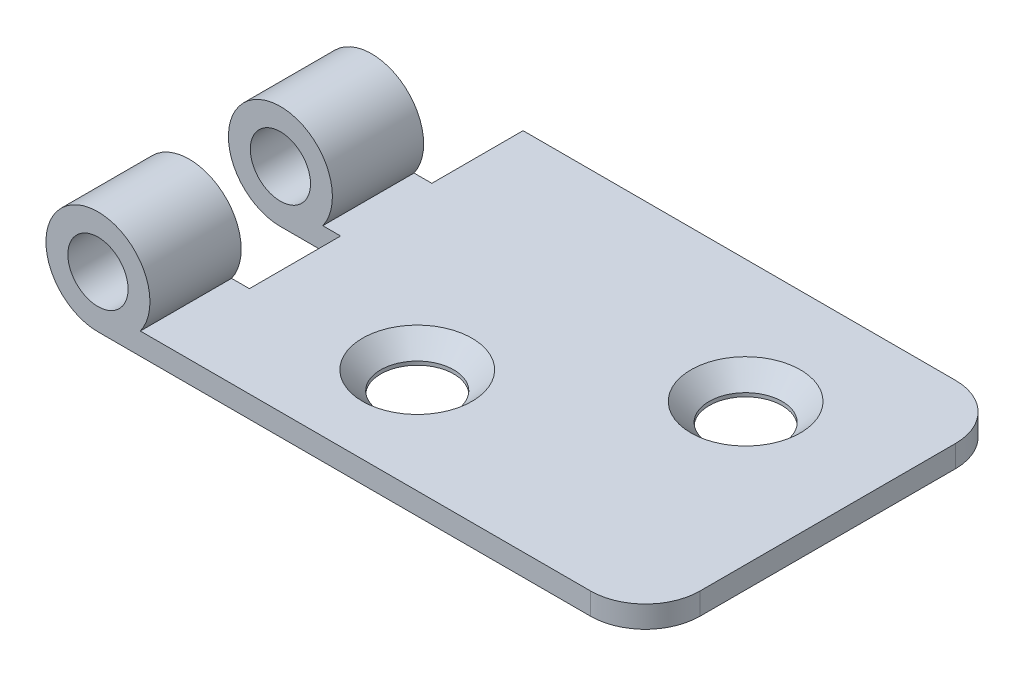
ISO-10303-21;
HEADER;
FILE_DESCRIPTION(('STEP AP214'),'2;1');
FILE_NAME('part.step','',(''),(''),'','','');
FILE_SCHEMA(('AUTOMOTIVE_DESIGN { 1 0 10303 214 1 1 1 1 }'));
ENDSEC;
DATA;
#1=APPLICATION_CONTEXT('core data for automotive mechanical design processes');
#2=APPLICATION_PROTOCOL_DEFINITION('international standard','automotive_design',2000,#1);
#3=PRODUCT_CONTEXT('',#1,'mechanical');
#4=PRODUCT('Part','Part','',(#3));
#5=PRODUCT_RELATED_PRODUCT_CATEGORY('part','',(#4));
#6=PRODUCT_DEFINITION_FORMATION('','',#4);
#7=PRODUCT_DEFINITION_CONTEXT('part definition',#1,'design');
#8=PRODUCT_DEFINITION('design','',#6,#7);
#9=PRODUCT_DEFINITION_SHAPE('','',#8);
#10=(LENGTH_UNIT() NAMED_UNIT(*) SI_UNIT(.MILLI.,.METRE.));
#11=(NAMED_UNIT(*) PLANE_ANGLE_UNIT() SI_UNIT($,.RADIAN.));
#12=(NAMED_UNIT(*) SI_UNIT($,.STERADIAN.) SOLID_ANGLE_UNIT());
#13=UNCERTAINTY_MEASURE_WITH_UNIT(LENGTH_MEASURE(1.E-05),#10,'distance_accuracy_value','');
#14=(GEOMETRIC_REPRESENTATION_CONTEXT(3) GLOBAL_UNCERTAINTY_ASSIGNED_CONTEXT((#13)) GLOBAL_UNIT_ASSIGNED_CONTEXT((#10,
#11,#12)) REPRESENTATION_CONTEXT('',''));
#15=CARTESIAN_POINT('',(0.,0.,0.));
#16=DIRECTION('',(0.,0.,1.));
#17=DIRECTION('',(1.,0.,0.));
#18=AXIS2_PLACEMENT_3D('',#15,#16,#17);
#19=CARTESIAN_POINT('',(30.,-1.65,20.));
#20=DIRECTION('',(0.,-1.,0.));
#21=DIRECTION('',(1.,0.,0.));
#22=AXIS2_PLACEMENT_3D('',#19,#20,#21);
#23=PLANE('',#22);
#24=CARTESIAN_POINT('',(11.75,-1.65,14.25));
#25=DIRECTION('',(0.,1.,0.));
#26=DIRECTION('',(0.,0.,1.));
#27=AXIS2_PLACEMENT_3D('',#24,#25,#26);
#28=CIRCLE('',#27,3.);
#29=CARTESIAN_POINT('',(11.75,-1.65,17.25));
#30=VERTEX_POINT('',#29);
#31=EDGE_CURVE('E394',#30,#30,#28,.T.);
#32=ORIENTED_EDGE('',*,*,#31,.F.);
#33=EDGE_LOOP('',(#32));
#34=FACE_BOUND('',#33,.T.);
#35=CARTESIAN_POINT('',(22.25,-1.65,6.75));
#36=DIRECTION('',(0.,1.,0.));
#37=DIRECTION('',(0.,0.,1.));
#38=AXIS2_PLACEMENT_3D('',#35,#36,#37);
#39=CIRCLE('',#38,3.);
#40=CARTESIAN_POINT('',(22.25,-1.65,9.75));
#41=VERTEX_POINT('',#40);
#42=EDGE_CURVE('E229',#41,#41,#39,.T.);
#43=ORIENTED_EDGE('',*,*,#42,.F.);
#44=EDGE_LOOP('',(#43));
#45=FACE_BOUND('',#44,.T.);
#46=DIRECTION('',(0.,0.,-1.));
#47=VECTOR('',#46,1.);
#48=CARTESIAN_POINT('',(30.,-1.65,20.));
#49=LINE('',#48,#47);
#50=CARTESIAN_POINT('',(30.,-1.65,17.));
#51=VERTEX_POINT('',#50);
#52=CARTESIAN_POINT('',(30.,-1.65,3.));
#53=VERTEX_POINT('',#52);
#54=EDGE_CURVE('E198',#51,#53,#49,.T.);
#55=ORIENTED_EDGE('',*,*,#54,.T.);
#56=CARTESIAN_POINT('',(27.,-1.65,3.));
#57=DIRECTION('',(0.,-1.,0.));
#58=DIRECTION('',(1.,0.,0.));
#59=AXIS2_PLACEMENT_3D('',#56,#57,#58);
#60=CIRCLE('',#59,3.);
#61=CARTESIAN_POINT('',(27.,-1.65,0.));
#62=VERTEX_POINT('',#61);
#63=EDGE_CURVE('E220',#53,#62,#60,.F.);
#64=ORIENTED_EDGE('',*,*,#63,.T.);
#65=DIRECTION('',(-1.,0.,0.));
#66=VECTOR('',#65,1.);
#67=CARTESIAN_POINT('',(30.,-1.65,0.));
#68=LINE('',#67,#66);
#69=CARTESIAN_POINT('',(3.3,-1.65,0.));
#70=VERTEX_POINT('',#69);
#71=EDGE_CURVE('E178',#62,#70,#68,.T.);
#72=ORIENTED_EDGE('',*,*,#71,.T.);
#73=DIRECTION('',(0.,0.,-1.));
#74=VECTOR('',#73,1.);
#75=CARTESIAN_POINT('',(3.3,-1.65,20.));
#76=LINE('',#75,#74);
#77=CARTESIAN_POINT('',(3.3,-1.65,5.));
#78=VERTEX_POINT('',#77);
#79=EDGE_CURVE('E172',#78,#70,#76,.T.);
#80=ORIENTED_EDGE('',*,*,#79,.F.);
#81=DIRECTION('',(1.,0.,0.));
#82=VECTOR('',#81,1.);
#83=CARTESIAN_POINT('',(30.,-1.65,5.));
#84=LINE('',#83,#82);
#85=CARTESIAN_POINT('',(2.32379000772445,-1.65,5.));
#86=VERTEX_POINT('',#85);
#87=EDGE_CURVE('E170',#86,#78,#84,.T.);
#88=ORIENTED_EDGE('',*,*,#87,.F.);
#89=DIRECTION('',(0.,0.,-1.));
#90=VECTOR('',#89,1.);
#91=CARTESIAN_POINT('',(2.32379000772445,-1.65,20.));
#92=LINE('',#91,#90);
#93=CARTESIAN_POINT('',(2.32379000772445,-1.65,10.));
#94=VERTEX_POINT('',#93);
#95=EDGE_CURVE('E195',#94,#86,#92,.T.);
#96=ORIENTED_EDGE('',*,*,#95,.F.);
#97=DIRECTION('',(-1.,0.,0.));
#98=VECTOR('',#97,1.);
#99=CARTESIAN_POINT('',(30.,-1.65,10.));
#100=LINE('',#99,#98);
#101=CARTESIAN_POINT('',(3.3,-1.65,10.));
#102=VERTEX_POINT('',#101);
#103=EDGE_CURVE('E153',#102,#94,#100,.T.);
#104=ORIENTED_EDGE('',*,*,#103,.F.);
#105=DIRECTION('',(0.,0.,-1.));
#106=VECTOR('',#105,1.);
#107=CARTESIAN_POINT('',(3.3,-1.65,20.));
#108=LINE('',#107,#106);
#109=CARTESIAN_POINT('',(3.3,-1.65,15.));
#110=VERTEX_POINT('',#109);
#111=EDGE_CURVE('E142',#110,#102,#108,.T.);
#112=ORIENTED_EDGE('',*,*,#111,.F.);
#113=DIRECTION('',(1.,0.,0.));
#114=VECTOR('',#113,1.);
#115=CARTESIAN_POINT('',(30.,-1.65,15.));
#116=LINE('',#115,#114);
#117=CARTESIAN_POINT('',(2.32379000772445,-1.65,15.));
#118=VERTEX_POINT('',#117);
#119=EDGE_CURVE('E126',#118,#110,#116,.T.);
#120=ORIENTED_EDGE('',*,*,#119,.F.);
#121=CARTESIAN_POINT('',(2.32379000772445,-1.65,20.));
#122=VERTEX_POINT('',#121);
#123=EDGE_CURVE('E196',#122,#118,#92,.T.);
#124=ORIENTED_EDGE('',*,*,#123,.F.);
#125=DIRECTION('',(-1.,0.,0.));
#126=VECTOR('',#125,1.);
#127=CARTESIAN_POINT('',(30.,-1.65,20.));
#128=LINE('',#127,#126);
#129=CARTESIAN_POINT('',(27.,-1.65,20.));
#130=VERTEX_POINT('',#129);
#131=EDGE_CURVE('E179',#130,#122,#128,.T.);
#132=ORIENTED_EDGE('',*,*,#131,.F.);
#133=CARTESIAN_POINT('',(27.,-1.65,17.));
#134=DIRECTION('',(0.,-1.,0.));
#135=DIRECTION('',(1.,0.,0.));
#136=AXIS2_PLACEMENT_3D('',#133,#134,#135);
#137=CIRCLE('',#136,3.);
#138=EDGE_CURVE('E218',#130,#51,#137,.F.);
#139=ORIENTED_EDGE('',*,*,#138,.T.);
#140=EDGE_LOOP('',(#55,#64,#72,#80,#88,#96,#104,#112,#120,#124,#132,#139));
#141=FACE_BOUND('',#140,.T.);
#142=ADVANCED_FACE('F32',(#34,#45,#141),#23,.F.);
#143=CARTESIAN_POINT('',(0.,0.,20.));
#144=DIRECTION('',(0.,0.,-1.));
#145=DIRECTION('',(-1.,0.,0.));
#146=AXIS2_PLACEMENT_3D('',#143,#144,#145);
#147=CYLINDRICAL_SURFACE('',#146,2.85);
#148=CARTESIAN_POINT('',(0.,0.,10.));
#149=DIRECTION('',(0.,0.,1.));
#150=DIRECTION('',(1.,0.,0.));
#151=AXIS2_PLACEMENT_3D('',#148,#149,#150);
#152=CIRCLE('',#151,2.85);
#153=CARTESIAN_POINT('',(0.,-2.85,10.));
#154=VERTEX_POINT('',#153);
#155=EDGE_CURVE('E158',#94,#154,#152,.T.);
#156=ORIENTED_EDGE('',*,*,#155,.F.);
#157=ORIENTED_EDGE('',*,*,#95,.T.);
#158=CARTESIAN_POINT('',(0.,0.,5.));
#159=DIRECTION('',(0.,0.,-1.));
#160=DIRECTION('',(-1.,0.,0.));
#161=AXIS2_PLACEMENT_3D('',#158,#159,#160);
#162=CIRCLE('',#161,2.85);
#163=CARTESIAN_POINT('',(0.,-2.85,5.));
#164=VERTEX_POINT('',#163);
#165=EDGE_CURVE('E167',#164,#86,#162,.T.);
#166=ORIENTED_EDGE('',*,*,#165,.F.);
#167=DIRECTION('',(0.,0.,-1.));
#168=VECTOR('',#167,1.);
#169=CARTESIAN_POINT('',(0.,-2.85,20.));
#170=LINE('',#169,#168);
#171=EDGE_CURVE('E191',#154,#164,#170,.T.);
#172=ORIENTED_EDGE('',*,*,#171,.F.);
#173=EDGE_LOOP('',(#156,#157,#166,#172));
#174=FACE_BOUND('',#173,.T.);
#175=ADVANCED_FACE('F249',(#174),#147,.T.);
#176=CARTESIAN_POINT('',(0.,0.,15.));
#177=DIRECTION('',(0.,0.,-1.));
#178=DIRECTION('',(-1.,0.,0.));
#179=AXIS2_PLACEMENT_3D('',#176,#177,#178);
#180=CIRCLE('',#179,2.85);
#181=CARTESIAN_POINT('',(0.,-2.85,15.));
#182=VERTEX_POINT('',#181);
#183=EDGE_CURVE('E132',#182,#118,#180,.T.);
#184=ORIENTED_EDGE('',*,*,#183,.F.);
#185=CARTESIAN_POINT('',(0.,-2.85,20.));
#186=VERTEX_POINT('',#185);
#187=EDGE_CURVE('E192',#186,#182,#170,.T.);
#188=ORIENTED_EDGE('',*,*,#187,.F.);
#189=CARTESIAN_POINT('',(0.,0.,20.));
#190=DIRECTION('',(0.,0.,1.));
#191=DIRECTION('',(1.,0.,0.));
#192=AXIS2_PLACEMENT_3D('',#189,#190,#191);
#193=CIRCLE('',#192,2.85);
#194=EDGE_CURVE('E181',#122,#186,#193,.T.);
#195=ORIENTED_EDGE('',*,*,#194,.F.);
#196=ORIENTED_EDGE('',*,*,#123,.T.);
#197=EDGE_LOOP('',(#184,#188,#195,#196));
#198=FACE_BOUND('',#197,.T.);
#199=ADVANCED_FACE('F277',(#198),#147,.T.);
#200=CARTESIAN_POINT('',(30.,-2.85,20.));
#201=DIRECTION('',(0.,1.,0.));
#202=DIRECTION('',(-1.,0.,0.));
#203=AXIS2_PLACEMENT_3D('',#200,#201,#202);
#204=PLANE('',#203);
#205=CARTESIAN_POINT('',(11.75,-2.85,14.25));
#206=DIRECTION('',(0.,1.,0.));
#207=DIRECTION('',(-1.,0.,0.));
#208=AXIS2_PLACEMENT_3D('',#205,#206,#207);
#209=CIRCLE('',#208,2.);
#210=CARTESIAN_POINT('',(9.75,-2.85,14.25));
#211=VERTEX_POINT('',#210);
#212=EDGE_CURVE('E36',#211,#211,#209,.T.);
#213=ORIENTED_EDGE('',*,*,#212,.T.);
#214=EDGE_LOOP('',(#213));
#215=FACE_BOUND('',#214,.T.);
#216=CARTESIAN_POINT('',(22.25,-2.85,6.75));
#217=DIRECTION('',(0.,1.,0.));
#218=DIRECTION('',(-1.,0.,0.));
#219=AXIS2_PLACEMENT_3D('',#216,#217,#218);
#220=CIRCLE('',#219,2.);
#221=CARTESIAN_POINT('',(20.25,-2.85,6.75));
#222=VERTEX_POINT('',#221);
#223=EDGE_CURVE('E148',#222,#222,#220,.T.);
#224=ORIENTED_EDGE('',*,*,#223,.T.);
#225=EDGE_LOOP('',(#224));
#226=FACE_BOUND('',#225,.T.);
#227=DIRECTION('',(1.,0.,0.));
#228=VECTOR('',#227,1.);
#229=CARTESIAN_POINT('',(30.,-2.85,0.));
#230=LINE('',#229,#228);
#231=CARTESIAN_POINT('',(3.3,-2.85,0.));
#232=VERTEX_POINT('',#231);
#233=CARTESIAN_POINT('',(27.,-2.85,0.));
#234=VERTEX_POINT('',#233);
#235=EDGE_CURVE('E182',#232,#234,#230,.T.);
#236=ORIENTED_EDGE('',*,*,#235,.T.);
#237=CARTESIAN_POINT('',(27.,-2.85,3.));
#238=DIRECTION('',(0.,1.,0.));
#239=DIRECTION('',(-1.,0.,0.));
#240=AXIS2_PLACEMENT_3D('',#237,#238,#239);
#241=CIRCLE('',#240,3.);
#242=CARTESIAN_POINT('',(30.,-2.85,3.));
#243=VERTEX_POINT('',#242);
#244=EDGE_CURVE('E41',#234,#243,#241,.F.);
#245=ORIENTED_EDGE('',*,*,#244,.T.);
#246=DIRECTION('',(0.,0.,-1.));
#247=VECTOR('',#246,1.);
#248=CARTESIAN_POINT('',(30.,-2.85,20.));
#249=LINE('',#248,#247);
#250=CARTESIAN_POINT('',(30.,-2.85,17.));
#251=VERTEX_POINT('',#250);
#252=EDGE_CURVE('E186',#251,#243,#249,.T.);
#253=ORIENTED_EDGE('',*,*,#252,.F.);
#254=CARTESIAN_POINT('',(27.,-2.85,17.));
#255=DIRECTION('',(0.,1.,0.));
#256=DIRECTION('',(-1.,0.,0.));
#257=AXIS2_PLACEMENT_3D('',#254,#255,#256);
#258=CIRCLE('',#257,3.);
#259=CARTESIAN_POINT('',(27.,-2.85,20.));
#260=VERTEX_POINT('',#259);
#261=EDGE_CURVE('E49',#251,#260,#258,.F.);
#262=ORIENTED_EDGE('',*,*,#261,.T.);
#263=DIRECTION('',(1.,0.,0.));
#264=VECTOR('',#263,1.);
#265=CARTESIAN_POINT('',(30.,-2.85,20.));
#266=LINE('',#265,#264);
#267=EDGE_CURVE('E184',#186,#260,#266,.T.);
#268=ORIENTED_EDGE('',*,*,#267,.F.);
#269=ORIENTED_EDGE('',*,*,#187,.T.);
#270=DIRECTION('',(-1.,0.,0.));
#271=VECTOR('',#270,1.);
#272=CARTESIAN_POINT('',(30.,-2.85,15.));
#273=LINE('',#272,#271);
#274=CARTESIAN_POINT('',(3.3,-2.85,15.));
#275=VERTEX_POINT('',#274);
#276=EDGE_CURVE('E208',#275,#182,#273,.T.);
#277=ORIENTED_EDGE('',*,*,#276,.F.);
#278=DIRECTION('',(0.,0.,1.));
#279=VECTOR('',#278,1.);
#280=CARTESIAN_POINT('',(3.3,-2.85,20.));
#281=LINE('',#280,#279);
#282=CARTESIAN_POINT('',(3.3,-2.85,10.));
#283=VERTEX_POINT('',#282);
#284=EDGE_CURVE('E145',#283,#275,#281,.T.);
#285=ORIENTED_EDGE('',*,*,#284,.F.);
#286=DIRECTION('',(1.,0.,0.));
#287=VECTOR('',#286,1.);
#288=CARTESIAN_POINT('',(30.,-2.85,10.));
#289=LINE('',#288,#287);
#290=EDGE_CURVE('E211',#154,#283,#289,.T.);
#291=ORIENTED_EDGE('',*,*,#290,.F.);
#292=ORIENTED_EDGE('',*,*,#171,.T.);
#293=DIRECTION('',(-1.,0.,0.));
#294=VECTOR('',#293,1.);
#295=CARTESIAN_POINT('',(30.,-2.85,5.));
#296=LINE('',#295,#294);
#297=CARTESIAN_POINT('',(3.3,-2.85,5.));
#298=VERTEX_POINT('',#297);
#299=EDGE_CURVE('E164',#298,#164,#296,.T.);
#300=ORIENTED_EDGE('',*,*,#299,.F.);
#301=DIRECTION('',(0.,0.,1.));
#302=VECTOR('',#301,1.);
#303=CARTESIAN_POINT('',(3.3,-2.85,20.));
#304=LINE('',#303,#302);
#305=EDGE_CURVE('E200',#232,#298,#304,.T.);
#306=ORIENTED_EDGE('',*,*,#305,.F.);
#307=EDGE_LOOP('',(#236,#245,#253,#262,#268,#269,#277,#285,#291,#292,#300,#306));
#308=FACE_BOUND('',#307,.T.);
#309=ADVANCED_FACE('F246',(#215,#226,#308),#204,.F.);
#310=CARTESIAN_POINT('',(0.,0.,20.));
#311=DIRECTION('',(0.,0.,-1.));
#312=DIRECTION('',(-1.,0.,0.));
#313=AXIS2_PLACEMENT_3D('',#310,#311,#312);
#314=CYLINDRICAL_SURFACE('',#313,1.65);
#315=CARTESIAN_POINT('',(0.,0.,5.));
#316=DIRECTION('',(0.,0.,-1.));
#317=DIRECTION('',(-1.,0.,0.));
#318=AXIS2_PLACEMENT_3D('',#315,#316,#317);
#319=CIRCLE('',#318,1.65);
#320=CARTESIAN_POINT('',(-1.65,0.,5.));
#321=VERTEX_POINT('',#320);
#322=EDGE_CURVE('E163',#321,#321,#319,.T.);
#323=ORIENTED_EDGE('',*,*,#322,.T.);
#324=EDGE_LOOP('',(#323));
#325=FACE_BOUND('',#324,.T.);
#326=CARTESIAN_POINT('',(0.,0.,10.));
#327=DIRECTION('',(0.,0.,1.));
#328=DIRECTION('',(1.,0.,0.));
#329=AXIS2_PLACEMENT_3D('',#326,#327,#328);
#330=CIRCLE('',#329,1.65);
#331=CARTESIAN_POINT('',(1.65,0.,10.));
#332=VERTEX_POINT('',#331);
#333=EDGE_CURVE('E137',#332,#332,#330,.T.);
#334=ORIENTED_EDGE('',*,*,#333,.T.);
#335=EDGE_LOOP('',(#334));
#336=FACE_BOUND('',#335,.T.);
#337=ADVANCED_FACE('F284',(#325,#336),#314,.F.);
#338=CARTESIAN_POINT('',(0.,0.,20.));
#339=DIRECTION('',(0.,0.,1.));
#340=DIRECTION('',(1.,0.,0.));
#341=AXIS2_PLACEMENT_3D('',#338,#339,#340);
#342=CIRCLE('',#341,1.65);
#343=CARTESIAN_POINT('',(1.65,0.,20.));
#344=VERTEX_POINT('',#343);
#345=EDGE_CURVE('E175',#344,#344,#342,.T.);
#346=ORIENTED_EDGE('',*,*,#345,.T.);
#347=EDGE_LOOP('',(#346));
#348=FACE_BOUND('',#347,.T.);
#349=CARTESIAN_POINT('',(0.,0.,15.));
#350=DIRECTION('',(0.,0.,-1.));
#351=DIRECTION('',(-1.,0.,0.));
#352=AXIS2_PLACEMENT_3D('',#349,#350,#351);
#353=CIRCLE('',#352,1.65);
#354=CARTESIAN_POINT('',(-1.65,0.,15.));
#355=VERTEX_POINT('',#354);
#356=EDGE_CURVE('E205',#355,#355,#353,.T.);
#357=ORIENTED_EDGE('',*,*,#356,.T.);
#358=EDGE_LOOP('',(#357));
#359=FACE_BOUND('',#358,.T.);
#360=ADVANCED_FACE('F322',(#348,#359),#314,.F.);
#361=CARTESIAN_POINT('',(0.,0.,0.));
#362=DIRECTION('',(0.,0.,1.));
#363=DIRECTION('',(1.,0.,0.));
#364=AXIS2_PLACEMENT_3D('',#361,#362,#363);
#365=PLANE('',#364);
#366=ORIENTED_EDGE('',*,*,#71,.F.);
#367=DIRECTION('',(0.,1.,0.));
#368=VECTOR('',#367,1.);
#369=CARTESIAN_POINT('',(27.,0.,0.));
#370=LINE('',#369,#368);
#371=EDGE_CURVE('E57',#62,#234,#370,.F.);
#372=ORIENTED_EDGE('',*,*,#371,.T.);
#373=ORIENTED_EDGE('',*,*,#235,.F.);
#374=DIRECTION('',(0.,-1.,0.));
#375=VECTOR('',#374,1.);
#376=CARTESIAN_POINT('',(3.3,18.35,0.));
#377=LINE('',#376,#375);
#378=EDGE_CURVE('E156',#70,#232,#377,.T.);
#379=ORIENTED_EDGE('',*,*,#378,.F.);
#380=EDGE_LOOP('',(#366,#372,#373,#379));
#381=FACE_BOUND('',#380,.T.);
#382=ADVANCED_FACE('F259',(#381),#365,.F.);
#383=CARTESIAN_POINT('',(0.,0.,20.));
#384=DIRECTION('',(0.,0.,1.));
#385=DIRECTION('',(1.,0.,0.));
#386=AXIS2_PLACEMENT_3D('',#383,#384,#385);
#387=PLANE('',#386);
#388=ORIENTED_EDGE('',*,*,#267,.T.);
#389=DIRECTION('',(0.,1.,0.));
#390=VECTOR('',#389,1.);
#391=CARTESIAN_POINT('',(27.,-1.65,20.));
#392=LINE('',#391,#390);
#393=EDGE_CURVE('E11',#260,#130,#392,.T.);
#394=ORIENTED_EDGE('',*,*,#393,.T.);
#395=ORIENTED_EDGE('',*,*,#131,.T.);
#396=ORIENTED_EDGE('',*,*,#194,.T.);
#397=EDGE_LOOP('',(#388,#394,#395,#396));
#398=FACE_BOUND('',#397,.T.);
#399=ORIENTED_EDGE('',*,*,#345,.F.);
#400=EDGE_LOOP('',(#399));
#401=FACE_BOUND('',#400,.T.);
#402=ADVANCED_FACE('F272',(#398,#401),#387,.T.);
#403=CARTESIAN_POINT('',(30.,-1.65,20.));
#404=DIRECTION('',(-1.,0.,0.));
#405=DIRECTION('',(0.,0.,1.));
#406=AXIS2_PLACEMENT_3D('',#403,#404,#405);
#407=PLANE('',#406);
#408=ORIENTED_EDGE('',*,*,#252,.T.);
#409=DIRECTION('',(0.,1.,0.));
#410=VECTOR('',#409,1.);
#411=CARTESIAN_POINT('',(30.,-1.65,3.));
#412=LINE('',#411,#410);
#413=EDGE_CURVE('E215',#243,#53,#412,.T.);
#414=ORIENTED_EDGE('',*,*,#413,.T.);
#415=ORIENTED_EDGE('',*,*,#54,.F.);
#416=DIRECTION('',(0.,1.,0.));
#417=VECTOR('',#416,1.);
#418=CARTESIAN_POINT('',(30.,-2.85,17.));
#419=LINE('',#418,#417);
#420=EDGE_CURVE('E213',#51,#251,#419,.F.);
#421=ORIENTED_EDGE('',*,*,#420,.T.);
#422=EDGE_LOOP('',(#408,#414,#415,#421));
#423=FACE_BOUND('',#422,.T.);
#424=ADVANCED_FACE('F266',(#423),#407,.F.);
#425=CARTESIAN_POINT('',(3.3,18.35,0.));
#426=DIRECTION('',(-1.,0.,0.));
#427=DIRECTION('',(0.,-1.,0.));
#428=AXIS2_PLACEMENT_3D('',#425,#426,#427);
#429=PLANE('',#428);
#430=ORIENTED_EDGE('',*,*,#79,.T.);
#431=ORIENTED_EDGE('',*,*,#378,.T.);
#432=ORIENTED_EDGE('',*,*,#305,.T.);
#433=DIRECTION('',(0.,-1.,0.));
#434=VECTOR('',#433,1.);
#435=CARTESIAN_POINT('',(3.3,18.35,5.));
#436=LINE('',#435,#434);
#437=EDGE_CURVE('E154',#78,#298,#436,.T.);
#438=ORIENTED_EDGE('',*,*,#437,.F.);
#439=EDGE_LOOP('',(#430,#431,#432,#438));
#440=FACE_BOUND('',#439,.T.);
#441=ADVANCED_FACE('F257',(#440),#429,.T.);
#442=CARTESIAN_POINT('',(3.3,18.35,5.));
#443=DIRECTION('',(0.,0.,-1.));
#444=DIRECTION('',(-1.,0.,0.));
#445=AXIS2_PLACEMENT_3D('',#442,#443,#444);
#446=PLANE('',#445);
#447=ORIENTED_EDGE('',*,*,#322,.F.);
#448=EDGE_LOOP('',(#447));
#449=FACE_BOUND('',#448,.T.);
#450=ORIENTED_EDGE('',*,*,#87,.T.);
#451=ORIENTED_EDGE('',*,*,#437,.T.);
#452=ORIENTED_EDGE('',*,*,#299,.T.);
#453=ORIENTED_EDGE('',*,*,#165,.T.);
#454=EDGE_LOOP('',(#450,#451,#452,#453));
#455=FACE_BOUND('',#454,.T.);
#456=ADVANCED_FACE('F252',(#449,#455),#446,.T.);
#457=CARTESIAN_POINT('',(3.3,18.35,10.));
#458=DIRECTION('',(-1.,0.,0.));
#459=DIRECTION('',(0.,-1.,0.));
#460=AXIS2_PLACEMENT_3D('',#457,#458,#459);
#461=PLANE('',#460);
#462=ORIENTED_EDGE('',*,*,#111,.T.);
#463=DIRECTION('',(0.,-1.,0.));
#464=VECTOR('',#463,1.);
#465=CARTESIAN_POINT('',(3.3,18.35,10.));
#466=LINE('',#465,#464);
#467=EDGE_CURVE('E147',#102,#283,#466,.T.);
#468=ORIENTED_EDGE('',*,*,#467,.T.);
#469=ORIENTED_EDGE('',*,*,#284,.T.);
#470=DIRECTION('',(0.,-1.,0.));
#471=VECTOR('',#470,1.);
#472=CARTESIAN_POINT('',(3.3,18.35,15.));
#473=LINE('',#472,#471);
#474=EDGE_CURVE('E129',#110,#275,#473,.T.);
#475=ORIENTED_EDGE('',*,*,#474,.F.);
#476=EDGE_LOOP('',(#462,#468,#469,#475));
#477=FACE_BOUND('',#476,.T.);
#478=ADVANCED_FACE('F140',(#477),#461,.T.);
#479=CARTESIAN_POINT('',(3.3,18.35,10.));
#480=DIRECTION('',(0.,0.,1.));
#481=DIRECTION('',(1.,0.,0.));
#482=AXIS2_PLACEMENT_3D('',#479,#480,#481);
#483=PLANE('',#482);
#484=ORIENTED_EDGE('',*,*,#333,.F.);
#485=EDGE_LOOP('',(#484));
#486=FACE_BOUND('',#485,.T.);
#487=ORIENTED_EDGE('',*,*,#103,.T.);
#488=ORIENTED_EDGE('',*,*,#155,.T.);
#489=ORIENTED_EDGE('',*,*,#290,.T.);
#490=ORIENTED_EDGE('',*,*,#467,.F.);
#491=EDGE_LOOP('',(#487,#488,#489,#490));
#492=FACE_BOUND('',#491,.T.);
#493=ADVANCED_FACE('F243',(#486,#492),#483,.T.);
#494=CARTESIAN_POINT('',(3.3,18.35,15.));
#495=DIRECTION('',(0.,0.,-1.));
#496=DIRECTION('',(-1.,0.,0.));
#497=AXIS2_PLACEMENT_3D('',#494,#495,#496);
#498=PLANE('',#497);
#499=ORIENTED_EDGE('',*,*,#356,.F.);
#500=EDGE_LOOP('',(#499));
#501=FACE_BOUND('',#500,.T.);
#502=ORIENTED_EDGE('',*,*,#119,.T.);
#503=ORIENTED_EDGE('',*,*,#474,.T.);
#504=ORIENTED_EDGE('',*,*,#276,.T.);
#505=ORIENTED_EDGE('',*,*,#183,.T.);
#506=EDGE_LOOP('',(#502,#503,#504,#505));
#507=FACE_BOUND('',#506,.T.);
#508=ADVANCED_FACE('F128',(#501,#507),#498,.T.);
#509=CARTESIAN_POINT('',(27.,-1.65,3.));
#510=DIRECTION('',(0.,1.,0.));
#511=DIRECTION('',(0.,0.,1.));
#512=AXIS2_PLACEMENT_3D('',#509,#510,#511);
#513=CYLINDRICAL_SURFACE('',#512,3.);
#514=ORIENTED_EDGE('',*,*,#244,.F.);
#515=ORIENTED_EDGE('',*,*,#371,.F.);
#516=ORIENTED_EDGE('',*,*,#63,.F.);
#517=ORIENTED_EDGE('',*,*,#413,.F.);
#518=EDGE_LOOP('',(#514,#515,#516,#517));
#519=FACE_BOUND('',#518,.T.);
#520=ADVANCED_FACE('F263',(#519),#513,.T.);
#521=CARTESIAN_POINT('',(27.,0.,17.));
#522=DIRECTION('',(0.,-1.,0.));
#523=DIRECTION('',(0.,0.,-1.));
#524=AXIS2_PLACEMENT_3D('',#521,#522,#523);
#525=CYLINDRICAL_SURFACE('',#524,3.);
#526=ORIENTED_EDGE('',*,*,#261,.F.);
#527=ORIENTED_EDGE('',*,*,#420,.F.);
#528=ORIENTED_EDGE('',*,*,#138,.F.);
#529=ORIENTED_EDGE('',*,*,#393,.F.);
#530=EDGE_LOOP('',(#526,#527,#528,#529));
#531=FACE_BOUND('',#530,.T.);
#532=ADVANCED_FACE('F34',(#531),#525,.T.);
#533=CARTESIAN_POINT('',(22.25,-1.65,6.75));
#534=DIRECTION('',(0.,1.,0.));
#535=DIRECTION('',(0.,0.,1.));
#536=AXIS2_PLACEMENT_3D('',#533,#534,#535);
#537=CYLINDRICAL_SURFACE('',#536,2.);
#538=CARTESIAN_POINT('',(22.25,-2.65,6.75));
#539=DIRECTION('',(0.,1.,0.));
#540=DIRECTION('',(0.,0.,1.));
#541=AXIS2_PLACEMENT_3D('',#538,#539,#540);
#542=CIRCLE('',#541,2.);
#543=CARTESIAN_POINT('',(22.25,-2.65,8.75));
#544=VERTEX_POINT('',#543);
#545=EDGE_CURVE('E225',#544,#544,#542,.T.);
#546=ORIENTED_EDGE('',*,*,#545,.T.);
#547=EDGE_LOOP('',(#546));
#548=FACE_BOUND('',#547,.T.);
#549=ORIENTED_EDGE('',*,*,#223,.F.);
#550=EDGE_LOOP('',(#549));
#551=FACE_BOUND('',#550,.T.);
#552=ADVANCED_FACE('F301',(#548,#551),#537,.F.);
#553=CARTESIAN_POINT('',(22.25,-1.65,6.75));
#554=DIRECTION('',(0.,1.,0.));
#555=DIRECTION('',(0.,0.,1.));
#556=AXIS2_PLACEMENT_3D('',#553,#554,#555);
#557=CONICAL_SURFACE('',#556,3.,0.785398163397449);
#558=ORIENTED_EDGE('',*,*,#545,.F.);
#559=EDGE_LOOP('',(#558));
#560=FACE_BOUND('',#559,.T.);
#561=ORIENTED_EDGE('',*,*,#42,.T.);
#562=EDGE_LOOP('',(#561));
#563=FACE_BOUND('',#562,.T.);
#564=ADVANCED_FACE('F357',(#560,#563),#557,.F.);
#565=CARTESIAN_POINT('',(11.75,-1.65,14.25));
#566=DIRECTION('',(0.,1.,0.));
#567=DIRECTION('',(0.,0.,1.));
#568=AXIS2_PLACEMENT_3D('',#565,#566,#567);
#569=CYLINDRICAL_SURFACE('',#568,2.);
#570=CARTESIAN_POINT('',(11.75,-2.65,14.25));
#571=DIRECTION('',(0.,1.,0.));
#572=DIRECTION('',(0.,0.,1.));
#573=AXIS2_PLACEMENT_3D('',#570,#571,#572);
#574=CIRCLE('',#573,2.);
#575=CARTESIAN_POINT('',(11.75,-2.65,16.25));
#576=VERTEX_POINT('',#575);
#577=EDGE_CURVE('E392',#576,#576,#574,.T.);
#578=ORIENTED_EDGE('',*,*,#577,.T.);
#579=EDGE_LOOP('',(#578));
#580=FACE_BOUND('',#579,.T.);
#581=ORIENTED_EDGE('',*,*,#212,.F.);
#582=EDGE_LOOP('',(#581));
#583=FACE_BOUND('',#582,.T.);
#584=ADVANCED_FACE('F366',(#580,#583),#569,.F.);
#585=CARTESIAN_POINT('',(11.75,-1.65,14.25));
#586=DIRECTION('',(0.,1.,0.));
#587=DIRECTION('',(0.,0.,1.));
#588=AXIS2_PLACEMENT_3D('',#585,#586,#587);
#589=CONICAL_SURFACE('',#588,3.,0.785398163397449);
#590=ORIENTED_EDGE('',*,*,#577,.F.);
#591=EDGE_LOOP('',(#590));
#592=FACE_BOUND('',#591,.T.);
#593=ORIENTED_EDGE('',*,*,#31,.T.);
#594=EDGE_LOOP('',(#593));
#595=FACE_BOUND('',#594,.T.);
#596=ADVANCED_FACE('F375',(#592,#595),#589,.F.);
#597=CLOSED_SHELL('',(#142,#175,#199,#309,#337,#360,#382,#402,#424,#441,#456,#478,#493,#508,
#520,#532,#552,#564,#584,#596));
#598=MANIFOLD_SOLID_BREP('B2',#597);
#599=ADVANCED_BREP_SHAPE_REPRESENTATION('',(#18,#598),#14);
#600=SHAPE_DEFINITION_REPRESENTATION(#9,#599);
ENDSEC;
END-ISO-10303-21;
